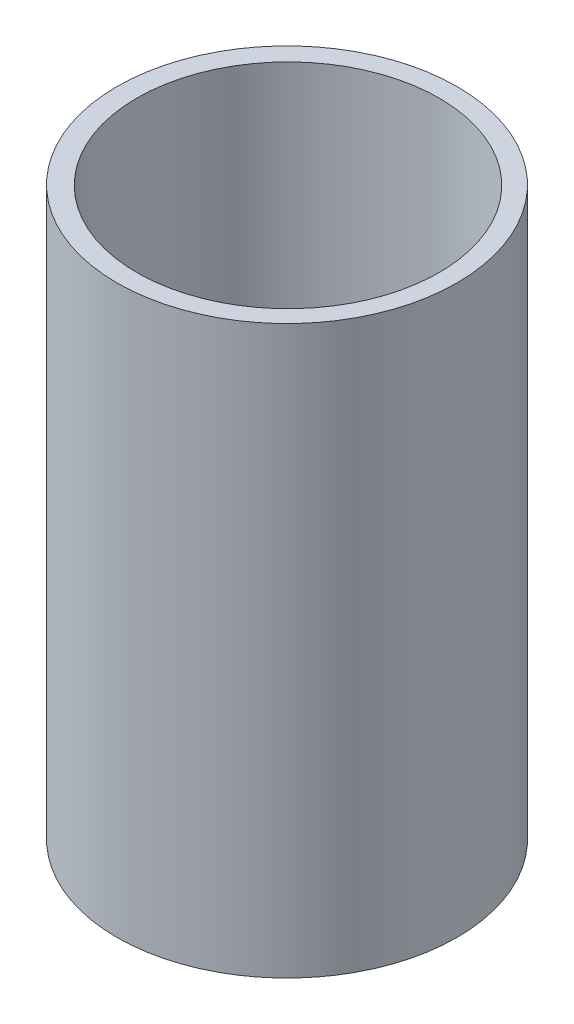
ISO-10303-21;
HEADER;
FILE_DESCRIPTION(('STEP AP214'),'2;1');
FILE_NAME('part.step','',(''),(''),'','','');
FILE_SCHEMA(('AUTOMOTIVE_DESIGN { 1 0 10303 214 1 1 1 1 }'));
ENDSEC;
DATA;
#1=APPLICATION_CONTEXT('core data for automotive mechanical design processes');
#2=APPLICATION_PROTOCOL_DEFINITION('international standard','automotive_design',2000,#1);
#3=PRODUCT_CONTEXT('',#1,'mechanical');
#4=PRODUCT('Part','Part','',(#3));
#5=PRODUCT_RELATED_PRODUCT_CATEGORY('part','',(#4));
#6=PRODUCT_DEFINITION_FORMATION('','',#4);
#7=PRODUCT_DEFINITION_CONTEXT('part definition',#1,'design');
#8=PRODUCT_DEFINITION('design','',#6,#7);
#9=PRODUCT_DEFINITION_SHAPE('','',#8);
#10=(LENGTH_UNIT() NAMED_UNIT(*) SI_UNIT(.MILLI.,.METRE.));
#11=(NAMED_UNIT(*) PLANE_ANGLE_UNIT() SI_UNIT($,.RADIAN.));
#12=(NAMED_UNIT(*) SI_UNIT($,.STERADIAN.) SOLID_ANGLE_UNIT());
#13=UNCERTAINTY_MEASURE_WITH_UNIT(LENGTH_MEASURE(1.E-05),#10,'distance_accuracy_value','');
#14=(GEOMETRIC_REPRESENTATION_CONTEXT(3) GLOBAL_UNCERTAINTY_ASSIGNED_CONTEXT((#13)) GLOBAL_UNIT_ASSIGNED_CONTEXT((#10,
#11,#12)) REPRESENTATION_CONTEXT('',''));
#15=CARTESIAN_POINT('',(0.,0.,0.));
#16=DIRECTION('',(0.,0.,1.));
#17=DIRECTION('',(1.,0.,0.));
#18=AXIS2_PLACEMENT_3D('',#15,#16,#17);
#19=CARTESIAN_POINT('',(20.,0.,0.));
#20=DIRECTION('',(0.,-1.,0.));
#21=DIRECTION('',(1.,0.,0.));
#22=AXIS2_PLACEMENT_3D('',#19,#20,#21);
#23=PLANE('',#22);
#24=CARTESIAN_POINT('',(20.0530223425658,0.,0.));
#25=DIRECTION('',(0.,1.,0.));
#26=DIRECTION('',(-1.,0.,0.));
#27=AXIS2_PLACEMENT_3D('',#24,#25,#26);
#28=CIRCLE('',#27,8.);
#29=CARTESIAN_POINT('',(12.0530223425658,0.,0.));
#30=VERTEX_POINT('',#29);
#31=EDGE_CURVE('E63',#30,#30,#28,.T.);
#32=ORIENTED_EDGE('',*,*,#31,.F.);
#33=EDGE_LOOP('',(#32));
#34=FACE_BOUND('',#33,.T.);
#35=CARTESIAN_POINT('',(20.,0.,0.));
#36=DIRECTION('',(0.,-1.,0.));
#37=DIRECTION('',(1.,0.,0.));
#38=AXIS2_PLACEMENT_3D('',#35,#36,#37);
#39=CIRCLE('',#38,9.);
#40=CARTESIAN_POINT('',(29.,0.,0.));
#41=VERTEX_POINT('',#40);
#42=EDGE_CURVE('E49',#41,#41,#39,.T.);
#43=ORIENTED_EDGE('',*,*,#42,.F.);
#44=EDGE_LOOP('',(#43));
#45=FACE_BOUND('',#44,.T.);
#46=ADVANCED_FACE('F43',(#34,#45),#23,.F.);
#47=CARTESIAN_POINT('',(20.,-30.,0.));
#48=DIRECTION('',(0.,-1.,0.));
#49=DIRECTION('',(1.,0.,0.));
#50=AXIS2_PLACEMENT_3D('',#47,#48,#49);
#51=PLANE('',#50);
#52=CARTESIAN_POINT('',(20.0530223425658,-30.,0.));
#53=DIRECTION('',(0.,-1.,0.));
#54=DIRECTION('',(1.,0.,0.));
#55=AXIS2_PLACEMENT_3D('',#52,#53,#54);
#56=CIRCLE('',#55,5.);
#57=CARTESIAN_POINT('',(25.0530223425658,-30.,0.));
#58=VERTEX_POINT('',#57);
#59=EDGE_CURVE('E53',#58,#58,#56,.T.);
#60=ORIENTED_EDGE('',*,*,#59,.F.);
#61=EDGE_LOOP('',(#60));
#62=FACE_BOUND('',#61,.T.);
#63=CARTESIAN_POINT('',(20.,-30.,0.));
#64=DIRECTION('',(0.,-1.,0.));
#65=DIRECTION('',(1.,0.,0.));
#66=AXIS2_PLACEMENT_3D('',#63,#64,#65);
#67=CIRCLE('',#66,9.);
#68=CARTESIAN_POINT('',(29.,-30.,0.));
#69=VERTEX_POINT('',#68);
#70=EDGE_CURVE('E11',#69,#69,#67,.T.);
#71=ORIENTED_EDGE('',*,*,#70,.T.);
#72=EDGE_LOOP('',(#71));
#73=FACE_BOUND('',#72,.T.);
#74=ADVANCED_FACE('F80',(#62,#73),#51,.T.);
#75=CARTESIAN_POINT('',(20.,0.,0.));
#76=DIRECTION('',(0.,-1.,0.));
#77=DIRECTION('',(1.,0.,0.));
#78=AXIS2_PLACEMENT_3D('',#75,#76,#77);
#79=CYLINDRICAL_SURFACE('',#78,9.);
#80=ORIENTED_EDGE('',*,*,#70,.F.);
#81=EDGE_LOOP('',(#80));
#82=FACE_BOUND('',#81,.T.);
#83=ORIENTED_EDGE('',*,*,#42,.T.);
#84=EDGE_LOOP('',(#83));
#85=FACE_BOUND('',#84,.T.);
#86=ADVANCED_FACE('F85',(#82,#85),#79,.T.);
#87=CARTESIAN_POINT('',(20.0530223425658,-15.,0.));
#88=DIRECTION('',(0.,-1.,0.));
#89=DIRECTION('',(1.,0.,0.));
#90=AXIS2_PLACEMENT_3D('',#87,#88,#89);
#91=CYLINDRICAL_SURFACE('',#90,5.);
#92=CARTESIAN_POINT('',(20.0530223425658,-15.,0.));
#93=DIRECTION('',(0.,-1.,0.));
#94=DIRECTION('',(1.,0.,0.));
#95=AXIS2_PLACEMENT_3D('',#92,#93,#94);
#96=CIRCLE('',#95,5.);
#97=CARTESIAN_POINT('',(25.0530223425658,-15.,0.));
#98=VERTEX_POINT('',#97);
#99=EDGE_CURVE('E57',#98,#98,#96,.T.);
#100=ORIENTED_EDGE('',*,*,#99,.F.);
#101=EDGE_LOOP('',(#100));
#102=FACE_BOUND('',#101,.T.);
#103=ORIENTED_EDGE('',*,*,#59,.T.);
#104=EDGE_LOOP('',(#103));
#105=FACE_BOUND('',#104,.T.);
#106=ADVANCED_FACE('F81',(#102,#105),#91,.F.);
#107=CARTESIAN_POINT('',(20.0530223425658,-15.,0.));
#108=DIRECTION('',(0.,1.,0.));
#109=DIRECTION('',(-1.,0.,0.));
#110=AXIS2_PLACEMENT_3D('',#107,#108,#109);
#111=PLANE('',#110);
#112=CARTESIAN_POINT('',(20.0530223425658,-15.,0.));
#113=DIRECTION('',(0.,1.,0.));
#114=DIRECTION('',(-1.,0.,0.));
#115=AXIS2_PLACEMENT_3D('',#112,#113,#114);
#116=CIRCLE('',#115,8.);
#117=CARTESIAN_POINT('',(12.0530223425658,-15.,0.));
#118=VERTEX_POINT('',#117);
#119=EDGE_CURVE('E62',#118,#118,#116,.T.);
#120=ORIENTED_EDGE('',*,*,#119,.T.);
#121=EDGE_LOOP('',(#120));
#122=FACE_BOUND('',#121,.T.);
#123=ORIENTED_EDGE('',*,*,#99,.T.);
#124=EDGE_LOOP('',(#123));
#125=FACE_BOUND('',#124,.T.);
#126=ADVANCED_FACE('F69',(#122,#125),#111,.T.);
#127=CARTESIAN_POINT('',(20.0530223425658,-15.,0.));
#128=DIRECTION('',(0.,1.,0.));
#129=DIRECTION('',(-1.,0.,0.));
#130=AXIS2_PLACEMENT_3D('',#127,#128,#129);
#131=CYLINDRICAL_SURFACE('',#130,8.);
#132=ORIENTED_EDGE('',*,*,#119,.F.);
#133=EDGE_LOOP('',(#132));
#134=FACE_BOUND('',#133,.T.);
#135=ORIENTED_EDGE('',*,*,#31,.T.);
#136=EDGE_LOOP('',(#135));
#137=FACE_BOUND('',#136,.T.);
#138=ADVANCED_FACE('F72',(#134,#137),#131,.F.);
#139=CLOSED_SHELL('',(#46,#74,#86,#106,#126,#138));
#140=MANIFOLD_SOLID_BREP('B2',#139);
#141=ADVANCED_BREP_SHAPE_REPRESENTATION('',(#18,#140),#14);
#142=SHAPE_DEFINITION_REPRESENTATION(#9,#141);
ENDSEC;
END-ISO-10303-21;
